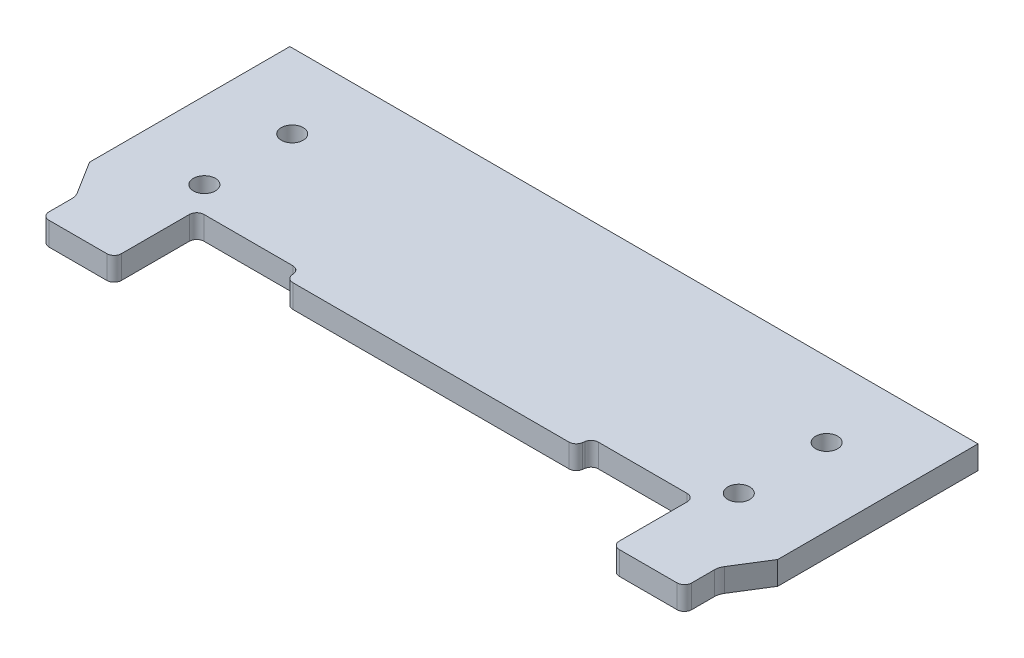
ISO-10303-21;
HEADER;
FILE_DESCRIPTION(('STEP AP214'),'2;1');
FILE_NAME('part.step','',(''),(''),'','','');
FILE_SCHEMA(('AUTOMOTIVE_DESIGN { 1 0 10303 214 1 1 1 1 }'));
ENDSEC;
DATA;
#1=APPLICATION_CONTEXT('core data for automotive mechanical design processes');
#2=APPLICATION_PROTOCOL_DEFINITION('international standard','automotive_design',2000,#1);
#3=PRODUCT_CONTEXT('',#1,'mechanical');
#4=PRODUCT('Part','Part','',(#3));
#5=PRODUCT_RELATED_PRODUCT_CATEGORY('part','',(#4));
#6=PRODUCT_DEFINITION_FORMATION('','',#4);
#7=PRODUCT_DEFINITION_CONTEXT('part definition',#1,'design');
#8=PRODUCT_DEFINITION('design','',#6,#7);
#9=PRODUCT_DEFINITION_SHAPE('','',#8);
#10=(LENGTH_UNIT() NAMED_UNIT(*) SI_UNIT(.MILLI.,.METRE.));
#11=(NAMED_UNIT(*) PLANE_ANGLE_UNIT() SI_UNIT($,.RADIAN.));
#12=(NAMED_UNIT(*) SI_UNIT($,.STERADIAN.) SOLID_ANGLE_UNIT());
#13=UNCERTAINTY_MEASURE_WITH_UNIT(LENGTH_MEASURE(1.E-05),#10,'distance_accuracy_value','');
#14=(GEOMETRIC_REPRESENTATION_CONTEXT(3) GLOBAL_UNCERTAINTY_ASSIGNED_CONTEXT((#13)) GLOBAL_UNIT_ASSIGNED_CONTEXT((#10,
#11,#12)) REPRESENTATION_CONTEXT('',''));
#15=CARTESIAN_POINT('',(0.,0.,0.));
#16=DIRECTION('',(0.,0.,1.));
#17=DIRECTION('',(1.,0.,0.));
#18=AXIS2_PLACEMENT_3D('',#15,#16,#17);
#19=CARTESIAN_POINT('',(0.,-1.5875,0.));
#20=DIRECTION('',(0.,1.,0.));
#21=DIRECTION('',(0.,0.,1.));
#22=AXIS2_PLACEMENT_3D('',#19,#20,#21);
#23=PLANE('',#22);
#24=CARTESIAN_POINT('',(36.5,-1.5875,38.));
#25=DIRECTION('',(0.,-1.,0.));
#26=DIRECTION('',(0.,0.,-1.));
#27=AXIS2_PLACEMENT_3D('',#24,#25,#26);
#28=CIRCLE('',#27,1.5);
#29=CARTESIAN_POINT('',(36.5,-1.5875,36.5));
#30=VERTEX_POINT('',#29);
#31=EDGE_CURVE('E281',#30,#30,#28,.T.);
#32=ORIENTED_EDGE('',*,*,#31,.F.);
#33=EDGE_LOOP('',(#32));
#34=FACE_BOUND('',#33,.T.);
#35=CARTESIAN_POINT('',(36.5,-1.5875,50.));
#36=DIRECTION('',(0.,-1.,0.));
#37=DIRECTION('',(0.,0.,-1.));
#38=AXIS2_PLACEMENT_3D('',#35,#36,#37);
#39=CIRCLE('',#38,1.5);
#40=CARTESIAN_POINT('',(36.5,-1.5875,48.5));
#41=VERTEX_POINT('',#40);
#42=EDGE_CURVE('E275',#41,#41,#39,.T.);
#43=ORIENTED_EDGE('',*,*,#42,.F.);
#44=EDGE_LOOP('',(#43));
#45=FACE_BOUND('',#44,.T.);
#46=CARTESIAN_POINT('',(-36.5,-1.5875,38.));
#47=DIRECTION('',(0.,-1.,0.));
#48=DIRECTION('',(0.,0.,-1.));
#49=AXIS2_PLACEMENT_3D('',#46,#47,#48);
#50=CIRCLE('',#49,1.5);
#51=CARTESIAN_POINT('',(-36.5,-1.5875,36.5));
#52=VERTEX_POINT('',#51);
#53=EDGE_CURVE('E269',#52,#52,#50,.T.);
#54=ORIENTED_EDGE('',*,*,#53,.F.);
#55=EDGE_LOOP('',(#54));
#56=FACE_BOUND('',#55,.T.);
#57=CARTESIAN_POINT('',(-36.5,-1.5875,50.));
#58=DIRECTION('',(0.,-1.,0.));
#59=DIRECTION('',(0.,0.,-1.));
#60=AXIS2_PLACEMENT_3D('',#57,#58,#59);
#61=CIRCLE('',#60,1.5);
#62=CARTESIAN_POINT('',(-36.5,-1.5875,48.5));
#63=VERTEX_POINT('',#62);
#64=EDGE_CURVE('E263',#63,#63,#61,.T.);
#65=ORIENTED_EDGE('',*,*,#64,.F.);
#66=EDGE_LOOP('',(#65));
#67=FACE_BOUND('',#66,.T.);
#68=DIRECTION('',(0.,0.,1.));
#69=VECTOR('',#68,1.);
#70=CARTESIAN_POINT('',(-47.,-1.5875,67.8266002747816));
#71=LINE('',#70,#69);
#72=CARTESIAN_POINT('',(-47.,-1.5875,27.8266002747816));
#73=VERTEX_POINT('',#72);
#74=CARTESIAN_POINT('',(-47.,-1.5875,55.1814992477408));
#75=VERTEX_POINT('',#74);
#76=EDGE_CURVE('E237',#73,#75,#71,.T.);
#77=ORIENTED_EDGE('',*,*,#76,.F.);
#78=DIRECTION('',(-1.,0.,0.));
#79=VECTOR('',#78,1.);
#80=CARTESIAN_POINT('',(-47.,-1.5875,27.8266002747816));
#81=LINE('',#80,#79);
#82=CARTESIAN_POINT('',(47.,-1.5875,27.8266002747816));
#83=VERTEX_POINT('',#82);
#84=EDGE_CURVE('E236',#83,#73,#81,.T.);
#85=ORIENTED_EDGE('',*,*,#84,.F.);
#86=DIRECTION('',(0.,0.,-1.));
#87=VECTOR('',#86,1.);
#88=CARTESIAN_POINT('',(47.,-1.5875,67.8266002747816));
#89=LINE('',#88,#87);
#90=CARTESIAN_POINT('',(47.,-1.5875,55.1814992477408));
#91=VERTEX_POINT('',#90);
#92=EDGE_CURVE('E227',#91,#83,#89,.T.);
#93=ORIENTED_EDGE('',*,*,#92,.F.);
#94=DIRECTION('',(0.529919264233203,0.,-0.848048096156427));
#95=VECTOR('',#94,1.);
#96=CARTESIAN_POINT('',(58.6001234444091,-1.5875,36.6174211585143));
#97=LINE('',#96,#95);
#98=CARTESIAN_POINT('',(44.198394579911,-1.5875,59.6650051382578));
#99=VERTEX_POINT('',#98);
#100=EDGE_CURVE('E256',#99,#91,#97,.T.);
#101=ORIENTED_EDGE('',*,*,#100,.F.);
#102=CARTESIAN_POINT('',(45.8944907722239,-1.5875,60.7248436667242));
#103=DIRECTION('',(0.,1.,0.));
#104=DIRECTION('',(0.,0.,1.));
#105=AXIS2_PLACEMENT_3D('',#102,#103,#104);
#106=CIRCLE('',#105,2.);
#107=CARTESIAN_POINT('',(43.8944907722239,-1.5875,60.7248436667242));
#108=VERTEX_POINT('',#107);
#109=EDGE_CURVE('E363',#99,#108,#106,.T.);
#110=ORIENTED_EDGE('',*,*,#109,.T.);
#111=DIRECTION('',(0.,0.,-1.));
#112=VECTOR('',#111,1.);
#113=CARTESIAN_POINT('',(43.8944907722239,-1.5875,0.));
#114=LINE('',#113,#112);
#115=CARTESIAN_POINT('',(43.8944907722239,-1.5875,63.8266002747816));
#116=VERTEX_POINT('',#115);
#117=EDGE_CURVE('E291',#116,#108,#114,.T.);
#118=ORIENTED_EDGE('',*,*,#117,.F.);
#119=CARTESIAN_POINT('',(42.8944907722239,-1.5875,63.8266002747816));
#120=DIRECTION('',(0.,1.,0.));
#121=DIRECTION('',(0.,0.,1.));
#122=AXIS2_PLACEMENT_3D('',#119,#120,#121);
#123=CIRCLE('',#122,1.);
#124=CARTESIAN_POINT('',(42.8944907722239,-1.5875,64.8266002747816));
#125=VERTEX_POINT('',#124);
#126=EDGE_CURVE('E384',#116,#125,#123,.F.);
#127=ORIENTED_EDGE('',*,*,#126,.T.);
#128=DIRECTION('',(-1.,0.,0.));
#129=VECTOR('',#128,1.);
#130=CARTESIAN_POINT('',(0.,-1.5875,64.8266002747816));
#131=LINE('',#130,#129);
#132=CARTESIAN_POINT('',(35.,-1.5875,64.8266002747816));
#133=VERTEX_POINT('',#132);
#134=EDGE_CURVE('E346',#125,#133,#131,.T.);
#135=ORIENTED_EDGE('',*,*,#134,.T.);
#136=CARTESIAN_POINT('',(35.,-1.5875,63.8266002747816));
#137=DIRECTION('',(0.,1.,0.));
#138=DIRECTION('',(0.,0.,1.));
#139=AXIS2_PLACEMENT_3D('',#136,#137,#138);
#140=CIRCLE('',#139,1.);
#141=CARTESIAN_POINT('',(34.,-1.5875,63.8266002747816));
#142=VERTEX_POINT('',#141);
#143=EDGE_CURVE('E378',#133,#142,#140,.F.);
#144=ORIENTED_EDGE('',*,*,#143,.T.);
#145=DIRECTION('',(0.,0.,-1.));
#146=VECTOR('',#145,1.);
#147=CARTESIAN_POINT('',(34.,-1.5875,0.));
#148=LINE('',#147,#146);
#149=CARTESIAN_POINT('',(34.,-1.5875,54.55));
#150=VERTEX_POINT('',#149);
#151=EDGE_CURVE('E343',#142,#150,#148,.T.);
#152=ORIENTED_EDGE('',*,*,#151,.T.);
#153=CARTESIAN_POINT('',(33.,-1.5875,54.55));
#154=DIRECTION('',(0.,1.,0.));
#155=DIRECTION('',(0.,0.,1.));
#156=AXIS2_PLACEMENT_3D('',#153,#154,#155);
#157=CIRCLE('',#156,1.);
#158=CARTESIAN_POINT('',(33.,-1.5875,53.55));
#159=VERTEX_POINT('',#158);
#160=EDGE_CURVE('E452',#150,#159,#157,.T.);
#161=ORIENTED_EDGE('',*,*,#160,.T.);
#162=DIRECTION('',(-1.,0.,0.));
#163=VECTOR('',#162,1.);
#164=CARTESIAN_POINT('',(0.,-1.5875,53.55));
#165=LINE('',#164,#163);
#166=CARTESIAN_POINT('',(20.8692867378162,-1.5875,53.55));
#167=VERTEX_POINT('',#166);
#168=EDGE_CURVE('E340',#159,#167,#165,.T.);
#169=ORIENTED_EDGE('',*,*,#168,.T.);
#170=CARTESIAN_POINT('',(20.8692867378162,-1.5875,54.55));
#171=DIRECTION('',(0.,1.,0.));
#172=DIRECTION('',(0.,0.,1.));
#173=AXIS2_PLACEMENT_3D('',#170,#171,#172);
#174=CIRCLE('',#173,1.);
#175=CARTESIAN_POINT('',(19.8790186690747,-1.5875,54.4108268990399));
#176=VERTEX_POINT('',#175);
#177=EDGE_CURVE('E448',#167,#176,#174,.T.);
#178=ORIENTED_EDGE('',*,*,#177,.T.);
#179=DIRECTION('',(-0.139173100960063,0.,0.990268068741571));
#180=VECTOR('',#179,1.);
#181=CARTESIAN_POINT('',(26.9928071613832,-1.5875,3.79359164942141));
#182=LINE('',#181,#180);
#183=CARTESIAN_POINT('',(19.8398996615206,-1.5875,54.6891731009601));
#184=VERTEX_POINT('',#183);
#185=EDGE_CURVE('E337',#176,#184,#182,.T.);
#186=ORIENTED_EDGE('',*,*,#185,.T.);
#187=CARTESIAN_POINT('',(18.849631592779,-1.5875,54.55));
#188=DIRECTION('',(0.,1.,0.));
#189=DIRECTION('',(0.,0.,1.));
#190=AXIS2_PLACEMENT_3D('',#187,#188,#189);
#191=CIRCLE('',#190,1.);
#192=CARTESIAN_POINT('',(18.849631592779,-1.5875,55.55));
#193=VERTEX_POINT('',#192);
#194=EDGE_CURVE('E382',#184,#193,#191,.F.);
#195=ORIENTED_EDGE('',*,*,#194,.T.);
#196=DIRECTION('',(1.,0.,0.));
#197=VECTOR('',#196,1.);
#198=CARTESIAN_POINT('',(0.,-1.5875,55.55));
#199=LINE('',#198,#197);
#200=CARTESIAN_POINT('',(-18.849631592779,-1.5875,55.55));
#201=VERTEX_POINT('',#200);
#202=EDGE_CURVE('E334',#201,#193,#199,.T.);
#203=ORIENTED_EDGE('',*,*,#202,.F.);
#204=CARTESIAN_POINT('',(-18.849631592779,-1.5875,54.55));
#205=DIRECTION('',(0.,1.,0.));
#206=DIRECTION('',(0.,0.,1.));
#207=AXIS2_PLACEMENT_3D('',#204,#205,#206);
#208=CIRCLE('',#207,1.);
#209=CARTESIAN_POINT('',(-19.8398996615206,-1.5875,54.6891731009601));
#210=VERTEX_POINT('',#209);
#211=EDGE_CURVE('E380',#201,#210,#208,.F.);
#212=ORIENTED_EDGE('',*,*,#211,.T.);
#213=DIRECTION('',(0.139173100960063,0.,0.990268068741571));
#214=VECTOR('',#213,1.);
#215=CARTESIAN_POINT('',(-26.9928071613832,-1.5875,3.7935916494214));
#216=LINE('',#215,#214);
#217=CARTESIAN_POINT('',(-19.8790186690747,-1.5875,54.4108268990399));
#218=VERTEX_POINT('',#217);
#219=EDGE_CURVE('E331',#218,#210,#216,.T.);
#220=ORIENTED_EDGE('',*,*,#219,.F.);
#221=CARTESIAN_POINT('',(-20.8692867378162,-1.5875,54.55));
#222=DIRECTION('',(0.,1.,0.));
#223=DIRECTION('',(0.,0.,1.));
#224=AXIS2_PLACEMENT_3D('',#221,#222,#223);
#225=CIRCLE('',#224,1.);
#226=CARTESIAN_POINT('',(-20.8692867378162,-1.5875,53.55));
#227=VERTEX_POINT('',#226);
#228=EDGE_CURVE('E444',#218,#227,#225,.T.);
#229=ORIENTED_EDGE('',*,*,#228,.T.);
#230=DIRECTION('',(1.,0.,0.));
#231=VECTOR('',#230,1.);
#232=CARTESIAN_POINT('',(0.,-1.5875,53.55));
#233=LINE('',#232,#231);
#234=CARTESIAN_POINT('',(-33.,-1.5875,53.55));
#235=VERTEX_POINT('',#234);
#236=EDGE_CURVE('E328',#235,#227,#233,.T.);
#237=ORIENTED_EDGE('',*,*,#236,.F.);
#238=CARTESIAN_POINT('',(-33.,-1.5875,54.55));
#239=DIRECTION('',(0.,1.,0.));
#240=DIRECTION('',(0.,0.,1.));
#241=AXIS2_PLACEMENT_3D('',#238,#239,#240);
#242=CIRCLE('',#241,1.);
#243=CARTESIAN_POINT('',(-34.,-1.5875,54.55));
#244=VERTEX_POINT('',#243);
#245=EDGE_CURVE('E456',#235,#244,#242,.T.);
#246=ORIENTED_EDGE('',*,*,#245,.T.);
#247=DIRECTION('',(0.,0.,1.));
#248=VECTOR('',#247,1.);
#249=CARTESIAN_POINT('',(-34.0000000000001,-1.5875,0.));
#250=LINE('',#249,#248);
#251=CARTESIAN_POINT('',(-34.,-1.5875,63.8266002747816));
#252=VERTEX_POINT('',#251);
#253=EDGE_CURVE('E325',#244,#252,#250,.T.);
#254=ORIENTED_EDGE('',*,*,#253,.T.);
#255=CARTESIAN_POINT('',(-35.,-1.5875,63.8266002747816));
#256=DIRECTION('',(0.,1.,0.));
#257=DIRECTION('',(0.,0.,1.));
#258=AXIS2_PLACEMENT_3D('',#255,#256,#257);
#259=CIRCLE('',#258,1.);
#260=CARTESIAN_POINT('',(-35.,-1.5875,64.8266002747816));
#261=VERTEX_POINT('',#260);
#262=EDGE_CURVE('E376',#252,#261,#259,.F.);
#263=ORIENTED_EDGE('',*,*,#262,.T.);
#264=DIRECTION('',(-1.,0.,0.));
#265=VECTOR('',#264,1.);
#266=CARTESIAN_POINT('',(0.,-1.5875,64.8266002747816));
#267=LINE('',#266,#265);
#268=CARTESIAN_POINT('',(-42.8944907722239,-1.5875,64.8266002747816));
#269=VERTEX_POINT('',#268);
#270=EDGE_CURVE('E322',#261,#269,#267,.T.);
#271=ORIENTED_EDGE('',*,*,#270,.T.);
#272=CARTESIAN_POINT('',(-42.8944907722239,-1.5875,63.8266002747816));
#273=DIRECTION('',(0.,1.,0.));
#274=DIRECTION('',(0.,0.,1.));
#275=AXIS2_PLACEMENT_3D('',#272,#273,#274);
#276=CIRCLE('',#275,1.);
#277=CARTESIAN_POINT('',(-43.8944907722239,-1.5875,63.8266002747816));
#278=VERTEX_POINT('',#277);
#279=EDGE_CURVE('E386',#269,#278,#276,.F.);
#280=ORIENTED_EDGE('',*,*,#279,.T.);
#281=DIRECTION('',(0.,0.,-1.));
#282=VECTOR('',#281,1.);
#283=CARTESIAN_POINT('',(-43.8944907722239,-1.5875,0.));
#284=LINE('',#283,#282);
#285=CARTESIAN_POINT('',(-43.8944907722239,-1.5875,60.7248436667241));
#286=VERTEX_POINT('',#285);
#287=EDGE_CURVE('E287',#278,#286,#284,.T.);
#288=ORIENTED_EDGE('',*,*,#287,.T.);
#289=CARTESIAN_POINT('',(-45.8944907722239,-1.5875,60.7248436667241));
#290=DIRECTION('',(0.,1.,0.));
#291=DIRECTION('',(0.,0.,1.));
#292=AXIS2_PLACEMENT_3D('',#289,#290,#291);
#293=CIRCLE('',#292,2.);
#294=CARTESIAN_POINT('',(-44.198394579911,-1.5875,59.6650051382577));
#295=VERTEX_POINT('',#294);
#296=EDGE_CURVE('E369',#286,#295,#293,.T.);
#297=ORIENTED_EDGE('',*,*,#296,.T.);
#298=DIRECTION('',(-0.529919264233203,0.,-0.848048096156427));
#299=VECTOR('',#298,1.);
#300=CARTESIAN_POINT('',(-58.600123444409,-1.5875,36.6174211585143));
#301=LINE('',#300,#299);
#302=EDGE_CURVE('E261',#295,#75,#301,.T.);
#303=ORIENTED_EDGE('',*,*,#302,.T.);
#304=EDGE_LOOP('',(#77,#85,#93,#101,#110,#118,#127,#135,#144,#152,#161,#169,#178,#186,#195,#203,
#212,#220,#229,#237,#246,#254,#263,#271,#280,#288,#297,#303));
#305=FACE_BOUND('',#304,.T.);
#306=ADVANCED_FACE('F42',(#34,#45,#56,#67,#305),#23,.F.);
#307=CARTESIAN_POINT('',(0.,1.5875,0.));
#308=DIRECTION('',(0.,1.,0.));
#309=DIRECTION('',(0.,0.,1.));
#310=AXIS2_PLACEMENT_3D('',#307,#308,#309);
#311=PLANE('',#310);
#312=CARTESIAN_POINT('',(36.5,1.5875,38.));
#313=DIRECTION('',(0.,-1.,0.));
#314=DIRECTION('',(0.,0.,-1.));
#315=AXIS2_PLACEMENT_3D('',#312,#313,#314);
#316=CIRCLE('',#315,1.5);
#317=CARTESIAN_POINT('',(36.5,1.5875,36.5));
#318=VERTEX_POINT('',#317);
#319=EDGE_CURVE('E284',#318,#318,#316,.T.);
#320=ORIENTED_EDGE('',*,*,#319,.T.);
#321=EDGE_LOOP('',(#320));
#322=FACE_BOUND('',#321,.T.);
#323=CARTESIAN_POINT('',(36.5,1.5875,50.));
#324=DIRECTION('',(0.,-1.,0.));
#325=DIRECTION('',(0.,0.,-1.));
#326=AXIS2_PLACEMENT_3D('',#323,#324,#325);
#327=CIRCLE('',#326,1.5);
#328=CARTESIAN_POINT('',(36.5,1.5875,48.5));
#329=VERTEX_POINT('',#328);
#330=EDGE_CURVE('E278',#329,#329,#327,.T.);
#331=ORIENTED_EDGE('',*,*,#330,.T.);
#332=EDGE_LOOP('',(#331));
#333=FACE_BOUND('',#332,.T.);
#334=CARTESIAN_POINT('',(-36.5,1.5875,38.));
#335=DIRECTION('',(0.,-1.,0.));
#336=DIRECTION('',(0.,0.,-1.));
#337=AXIS2_PLACEMENT_3D('',#334,#335,#336);
#338=CIRCLE('',#337,1.5);
#339=CARTESIAN_POINT('',(-36.5,1.5875,36.5));
#340=VERTEX_POINT('',#339);
#341=EDGE_CURVE('E272',#340,#340,#338,.T.);
#342=ORIENTED_EDGE('',*,*,#341,.T.);
#343=EDGE_LOOP('',(#342));
#344=FACE_BOUND('',#343,.T.);
#345=CARTESIAN_POINT('',(-36.5,1.5875,50.));
#346=DIRECTION('',(0.,-1.,0.));
#347=DIRECTION('',(0.,0.,-1.));
#348=AXIS2_PLACEMENT_3D('',#345,#346,#347);
#349=CIRCLE('',#348,1.5);
#350=CARTESIAN_POINT('',(-36.5,1.5875,48.5));
#351=VERTEX_POINT('',#350);
#352=EDGE_CURVE('E266',#351,#351,#349,.T.);
#353=ORIENTED_EDGE('',*,*,#352,.T.);
#354=EDGE_LOOP('',(#353));
#355=FACE_BOUND('',#354,.T.);
#356=DIRECTION('',(-1.,0.,0.));
#357=VECTOR('',#356,1.);
#358=CARTESIAN_POINT('',(0.,1.5875,27.8266002747816));
#359=LINE('',#358,#357);
#360=CARTESIAN_POINT('',(47.,1.5875,27.8266002747816));
#361=VERTEX_POINT('',#360);
#362=CARTESIAN_POINT('',(-47.,1.5875,27.8266002747816));
#363=VERTEX_POINT('',#362);
#364=EDGE_CURVE('E12',#361,#363,#359,.T.);
#365=ORIENTED_EDGE('',*,*,#364,.T.);
#366=DIRECTION('',(0.,0.,1.));
#367=VECTOR('',#366,1.);
#368=CARTESIAN_POINT('',(-47.,1.5875,0.));
#369=LINE('',#368,#367);
#370=CARTESIAN_POINT('',(-47.,1.5875,55.1814992477408));
#371=VERTEX_POINT('',#370);
#372=EDGE_CURVE('E252',#363,#371,#369,.T.);
#373=ORIENTED_EDGE('',*,*,#372,.T.);
#374=DIRECTION('',(0.529919264233203,0.,0.848048096156427));
#375=VECTOR('',#374,1.);
#376=CARTESIAN_POINT('',(-58.600123444409,1.5875,36.6174211585143));
#377=LINE('',#376,#375);
#378=CARTESIAN_POINT('',(-44.198394579911,1.5875,59.6650051382577));
#379=VERTEX_POINT('',#378);
#380=EDGE_CURVE('E258',#371,#379,#377,.T.);
#381=ORIENTED_EDGE('',*,*,#380,.T.);
#382=CARTESIAN_POINT('',(-45.8944907722239,1.5875,60.7248436667241));
#383=DIRECTION('',(0.,1.,0.));
#384=DIRECTION('',(0.,0.,1.));
#385=AXIS2_PLACEMENT_3D('',#382,#383,#384);
#386=CIRCLE('',#385,2.);
#387=CARTESIAN_POINT('',(-43.8944907722239,1.5875,60.7248436667241));
#388=VERTEX_POINT('',#387);
#389=EDGE_CURVE('E366',#379,#388,#386,.F.);
#390=ORIENTED_EDGE('',*,*,#389,.T.);
#391=DIRECTION('',(0.,0.,-1.));
#392=VECTOR('',#391,1.);
#393=CARTESIAN_POINT('',(-43.8944907722239,1.5875,0.));
#394=LINE('',#393,#392);
#395=CARTESIAN_POINT('',(-43.8944907722239,1.5875,63.8266002747816));
#396=VERTEX_POINT('',#395);
#397=EDGE_CURVE('E288',#396,#388,#394,.T.);
#398=ORIENTED_EDGE('',*,*,#397,.F.);
#399=CARTESIAN_POINT('',(-42.8944907722239,1.5875,63.8266002747816));
#400=DIRECTION('',(0.,1.,0.));
#401=DIRECTION('',(0.,0.,1.));
#402=AXIS2_PLACEMENT_3D('',#399,#400,#401);
#403=CIRCLE('',#402,1.);
#404=CARTESIAN_POINT('',(-42.8944907722239,1.5875,64.8266002747816));
#405=VERTEX_POINT('',#404);
#406=EDGE_CURVE('E399',#396,#405,#403,.T.);
#407=ORIENTED_EDGE('',*,*,#406,.T.);
#408=DIRECTION('',(-1.,0.,0.));
#409=VECTOR('',#408,1.);
#410=CARTESIAN_POINT('',(0.,1.5875,64.8266002747816));
#411=LINE('',#410,#409);
#412=CARTESIAN_POINT('',(-35.,1.5875,64.8266002747816));
#413=VERTEX_POINT('',#412);
#414=EDGE_CURVE('E290',#413,#405,#411,.T.);
#415=ORIENTED_EDGE('',*,*,#414,.F.);
#416=CARTESIAN_POINT('',(-35.,1.5875,63.8266002747816));
#417=DIRECTION('',(0.,1.,0.));
#418=DIRECTION('',(0.,0.,1.));
#419=AXIS2_PLACEMENT_3D('',#416,#417,#418);
#420=CIRCLE('',#419,1.);
#421=CARTESIAN_POINT('',(-34.,1.5875,63.8266002747816));
#422=VERTEX_POINT('',#421);
#423=EDGE_CURVE('E390',#413,#422,#420,.T.);
#424=ORIENTED_EDGE('',*,*,#423,.T.);
#425=DIRECTION('',(0.,0.,1.));
#426=VECTOR('',#425,1.);
#427=CARTESIAN_POINT('',(-34.0000000000001,1.5875,0.));
#428=LINE('',#427,#426);
#429=CARTESIAN_POINT('',(-34.,1.5875,54.55));
#430=VERTEX_POINT('',#429);
#431=EDGE_CURVE('E294',#430,#422,#428,.T.);
#432=ORIENTED_EDGE('',*,*,#431,.F.);
#433=CARTESIAN_POINT('',(-33.,1.5875,54.55));
#434=DIRECTION('',(0.,1.,0.));
#435=DIRECTION('',(0.,0.,1.));
#436=AXIS2_PLACEMENT_3D('',#433,#434,#435);
#437=CIRCLE('',#436,1.);
#438=CARTESIAN_POINT('',(-33.,1.5875,53.55));
#439=VERTEX_POINT('',#438);
#440=EDGE_CURVE('E458',#430,#439,#437,.F.);
#441=ORIENTED_EDGE('',*,*,#440,.T.);
#442=DIRECTION('',(1.,0.,0.));
#443=VECTOR('',#442,1.);
#444=CARTESIAN_POINT('',(0.,1.5875,53.55));
#445=LINE('',#444,#443);
#446=CARTESIAN_POINT('',(-20.8692867378162,1.5875,53.55));
#447=VERTEX_POINT('',#446);
#448=EDGE_CURVE('E297',#439,#447,#445,.T.);
#449=ORIENTED_EDGE('',*,*,#448,.T.);
#450=CARTESIAN_POINT('',(-20.8692867378162,1.5875,54.55));
#451=DIRECTION('',(0.,1.,0.));
#452=DIRECTION('',(0.,0.,1.));
#453=AXIS2_PLACEMENT_3D('',#450,#451,#452);
#454=CIRCLE('',#453,1.);
#455=CARTESIAN_POINT('',(-19.8790186690747,1.5875,54.4108268990399));
#456=VERTEX_POINT('',#455);
#457=EDGE_CURVE('E446',#447,#456,#454,.F.);
#458=ORIENTED_EDGE('',*,*,#457,.T.);
#459=DIRECTION('',(0.139173100960063,0.,0.990268068741571));
#460=VECTOR('',#459,1.);
#461=CARTESIAN_POINT('',(-26.9928071613832,1.5875,3.7935916494214));
#462=LINE('',#461,#460);
#463=CARTESIAN_POINT('',(-19.8398996615206,1.5875,54.6891731009601));
#464=VERTEX_POINT('',#463);
#465=EDGE_CURVE('E300',#456,#464,#462,.T.);
#466=ORIENTED_EDGE('',*,*,#465,.T.);
#467=CARTESIAN_POINT('',(-18.849631592779,1.5875,54.55));
#468=DIRECTION('',(0.,1.,0.));
#469=DIRECTION('',(0.,0.,1.));
#470=AXIS2_PLACEMENT_3D('',#467,#468,#469);
#471=CIRCLE('',#470,1.);
#472=CARTESIAN_POINT('',(-18.849631592779,1.5875,55.55));
#473=VERTEX_POINT('',#472);
#474=EDGE_CURVE('E394',#464,#473,#471,.T.);
#475=ORIENTED_EDGE('',*,*,#474,.T.);
#476=DIRECTION('',(1.,0.,0.));
#477=VECTOR('',#476,1.);
#478=CARTESIAN_POINT('',(0.,1.5875,55.55));
#479=LINE('',#478,#477);
#480=CARTESIAN_POINT('',(18.849631592779,1.5875,55.55));
#481=VERTEX_POINT('',#480);
#482=EDGE_CURVE('E303',#473,#481,#479,.T.);
#483=ORIENTED_EDGE('',*,*,#482,.T.);
#484=CARTESIAN_POINT('',(18.849631592779,1.5875,54.55));
#485=DIRECTION('',(0.,1.,0.));
#486=DIRECTION('',(0.,0.,1.));
#487=AXIS2_PLACEMENT_3D('',#484,#485,#486);
#488=CIRCLE('',#487,1.);
#489=CARTESIAN_POINT('',(19.8398996615206,1.5875,54.6891731009601));
#490=VERTEX_POINT('',#489);
#491=EDGE_CURVE('E396',#481,#490,#488,.T.);
#492=ORIENTED_EDGE('',*,*,#491,.T.);
#493=DIRECTION('',(-0.139173100960063,0.,0.990268068741571));
#494=VECTOR('',#493,1.);
#495=CARTESIAN_POINT('',(26.9928071613832,1.5875,3.79359164942141));
#496=LINE('',#495,#494);
#497=CARTESIAN_POINT('',(19.8790186690747,1.5875,54.4108268990399));
#498=VERTEX_POINT('',#497);
#499=EDGE_CURVE('E306',#498,#490,#496,.T.);
#500=ORIENTED_EDGE('',*,*,#499,.F.);
#501=CARTESIAN_POINT('',(20.8692867378162,1.5875,54.55));
#502=DIRECTION('',(0.,1.,0.));
#503=DIRECTION('',(0.,0.,1.));
#504=AXIS2_PLACEMENT_3D('',#501,#502,#503);
#505=CIRCLE('',#504,1.);
#506=CARTESIAN_POINT('',(20.8692867378162,1.5875,53.55));
#507=VERTEX_POINT('',#506);
#508=EDGE_CURVE('E450',#498,#507,#505,.F.);
#509=ORIENTED_EDGE('',*,*,#508,.T.);
#510=DIRECTION('',(-1.,0.,0.));
#511=VECTOR('',#510,1.);
#512=CARTESIAN_POINT('',(0.,1.5875,53.55));
#513=LINE('',#512,#511);
#514=CARTESIAN_POINT('',(33.,1.5875,53.55));
#515=VERTEX_POINT('',#514);
#516=EDGE_CURVE('E309',#515,#507,#513,.T.);
#517=ORIENTED_EDGE('',*,*,#516,.F.);
#518=CARTESIAN_POINT('',(33.,1.5875,54.55));
#519=DIRECTION('',(0.,1.,0.));
#520=DIRECTION('',(0.,0.,1.));
#521=AXIS2_PLACEMENT_3D('',#518,#519,#520);
#522=CIRCLE('',#521,1.);
#523=CARTESIAN_POINT('',(34.,1.5875,54.55));
#524=VERTEX_POINT('',#523);
#525=EDGE_CURVE('E454',#515,#524,#522,.F.);
#526=ORIENTED_EDGE('',*,*,#525,.T.);
#527=DIRECTION('',(0.,0.,-1.));
#528=VECTOR('',#527,1.);
#529=CARTESIAN_POINT('',(34.,1.5875,0.));
#530=LINE('',#529,#528);
#531=CARTESIAN_POINT('',(34.,1.5875,63.8266002747816));
#532=VERTEX_POINT('',#531);
#533=EDGE_CURVE('E312',#532,#524,#530,.T.);
#534=ORIENTED_EDGE('',*,*,#533,.F.);
#535=CARTESIAN_POINT('',(35.,1.5875,63.8266002747816));
#536=DIRECTION('',(0.,1.,0.));
#537=DIRECTION('',(0.,0.,1.));
#538=AXIS2_PLACEMENT_3D('',#535,#536,#537);
#539=CIRCLE('',#538,1.);
#540=CARTESIAN_POINT('',(35.,1.5875,64.8266002747816));
#541=VERTEX_POINT('',#540);
#542=EDGE_CURVE('E392',#532,#541,#539,.T.);
#543=ORIENTED_EDGE('',*,*,#542,.T.);
#544=DIRECTION('',(-1.,0.,0.));
#545=VECTOR('',#544,1.);
#546=CARTESIAN_POINT('',(0.,1.5875,64.8266002747816));
#547=LINE('',#546,#545);
#548=CARTESIAN_POINT('',(42.8944907722239,1.5875,64.8266002747816));
#549=VERTEX_POINT('',#548);
#550=EDGE_CURVE('E315',#549,#541,#547,.T.);
#551=ORIENTED_EDGE('',*,*,#550,.F.);
#552=CARTESIAN_POINT('',(42.8944907722239,1.5875,63.8266002747816));
#553=DIRECTION('',(0.,1.,0.));
#554=DIRECTION('',(0.,0.,1.));
#555=AXIS2_PLACEMENT_3D('',#552,#553,#554);
#556=CIRCLE('',#555,1.);
#557=CARTESIAN_POINT('',(43.8944907722239,1.5875,63.8266002747816));
#558=VERTEX_POINT('',#557);
#559=EDGE_CURVE('E65',#549,#558,#556,.T.);
#560=ORIENTED_EDGE('',*,*,#559,.T.);
#561=DIRECTION('',(0.,0.,-1.));
#562=VECTOR('',#561,1.);
#563=CARTESIAN_POINT('',(43.8944907722239,1.5875,0.));
#564=LINE('',#563,#562);
#565=CARTESIAN_POINT('',(43.8944907722239,1.5875,60.7248436667242));
#566=VERTEX_POINT('',#565);
#567=EDGE_CURVE('E318',#558,#566,#564,.T.);
#568=ORIENTED_EDGE('',*,*,#567,.T.);
#569=CARTESIAN_POINT('',(45.8944907722239,1.5875,60.7248436667242));
#570=DIRECTION('',(0.,1.,0.));
#571=DIRECTION('',(0.,0.,1.));
#572=AXIS2_PLACEMENT_3D('',#569,#570,#571);
#573=CIRCLE('',#572,2.);
#574=CARTESIAN_POINT('',(44.198394579911,1.5875,59.6650051382578));
#575=VERTEX_POINT('',#574);
#576=EDGE_CURVE('E360',#566,#575,#573,.F.);
#577=ORIENTED_EDGE('',*,*,#576,.T.);
#578=DIRECTION('',(-0.529919264233203,0.,0.848048096156427));
#579=VECTOR('',#578,1.);
#580=CARTESIAN_POINT('',(58.6001234444091,1.5875,36.6174211585143));
#581=LINE('',#580,#579);
#582=CARTESIAN_POINT('',(47.,1.5875,55.1814992477408));
#583=VERTEX_POINT('',#582);
#584=EDGE_CURVE('E255',#583,#575,#581,.T.);
#585=ORIENTED_EDGE('',*,*,#584,.F.);
#586=DIRECTION('',(0.,0.,-1.));
#587=VECTOR('',#586,1.);
#588=CARTESIAN_POINT('',(47.,1.5875,0.));
#589=LINE('',#588,#587);
#590=EDGE_CURVE('E57',#583,#361,#589,.T.);
#591=ORIENTED_EDGE('',*,*,#590,.T.);
#592=EDGE_LOOP('',(#365,#373,#381,#390,#398,#407,#415,#424,#432,#441,#449,#458,#466,#475,#483,
#492,#500,#509,#517,#526,#534,#543,#551,#560,#568,#577,#585,#591));
#593=FACE_BOUND('',#592,.T.);
#594=ADVANCED_FACE('F474',(#322,#333,#344,#355,#593),#311,.T.);
#595=CARTESIAN_POINT('',(-58.600123444409,-54.0387091134937,36.6174211585143));
#596=DIRECTION('',(-0.848048096156427,0.,0.529919264233203));
#597=DIRECTION('',(0.529919264233203,0.,0.848048096156427));
#598=AXIS2_PLACEMENT_3D('',#595,#596,#597);
#599=PLANE('',#598);
#600=ORIENTED_EDGE('',*,*,#380,.F.);
#601=DIRECTION('',(0.,-1.,0.));
#602=VECTOR('',#601,1.);
#603=CARTESIAN_POINT('',(-47.,-54.0387091134937,55.1814992477408));
#604=LINE('',#603,#602);
#605=EDGE_CURVE('E50',#371,#75,#604,.T.);
#606=ORIENTED_EDGE('',*,*,#605,.T.);
#607=ORIENTED_EDGE('',*,*,#302,.F.);
#608=DIRECTION('',(0.,1.,0.));
#609=VECTOR('',#608,1.);
#610=CARTESIAN_POINT('',(-44.198394579911,1.5875,59.6650051382577));
#611=LINE('',#610,#609);
#612=EDGE_CURVE('E354',#295,#379,#611,.T.);
#613=ORIENTED_EDGE('',*,*,#612,.T.);
#614=EDGE_LOOP('',(#600,#606,#607,#613));
#615=FACE_BOUND('',#614,.T.);
#616=ADVANCED_FACE('F464',(#615),#599,.T.);
#617=CARTESIAN_POINT('',(58.6001234444091,-54.0387091134937,36.6174211585143));
#618=DIRECTION('',(-0.848048096156427,0.,-0.529919264233203));
#619=DIRECTION('',(-0.529919264233203,0.,0.848048096156427));
#620=AXIS2_PLACEMENT_3D('',#617,#618,#619);
#621=PLANE('',#620);
#622=DIRECTION('',(0.,-1.,0.));
#623=VECTOR('',#622,1.);
#624=CARTESIAN_POINT('',(47.,-54.0387091134937,55.1814992477408));
#625=LINE('',#624,#623);
#626=EDGE_CURVE('E231',#583,#91,#625,.T.);
#627=ORIENTED_EDGE('',*,*,#626,.F.);
#628=ORIENTED_EDGE('',*,*,#584,.T.);
#629=DIRECTION('',(0.,1.,0.));
#630=VECTOR('',#629,1.);
#631=CARTESIAN_POINT('',(44.198394579911,-1.5875,59.6650051382578));
#632=LINE('',#631,#630);
#633=EDGE_CURVE('E352',#575,#99,#632,.F.);
#634=ORIENTED_EDGE('',*,*,#633,.T.);
#635=ORIENTED_EDGE('',*,*,#100,.T.);
#636=EDGE_LOOP('',(#627,#628,#634,#635));
#637=FACE_BOUND('',#636,.T.);
#638=ADVANCED_FACE('F504',(#637),#621,.F.);
#639=CARTESIAN_POINT('',(43.8944907722239,1.5875,0.));
#640=DIRECTION('',(-1.,0.,0.));
#641=DIRECTION('',(0.,0.,1.));
#642=AXIS2_PLACEMENT_3D('',#639,#640,#641);
#643=PLANE('',#642);
#644=ORIENTED_EDGE('',*,*,#567,.F.);
#645=DIRECTION('',(0.,-1.,0.));
#646=VECTOR('',#645,1.);
#647=CARTESIAN_POINT('',(43.8944907722239,-1.5875,63.8266002747816));
#648=LINE('',#647,#646);
#649=EDGE_CURVE('E401',#558,#116,#648,.T.);
#650=ORIENTED_EDGE('',*,*,#649,.T.);
#651=ORIENTED_EDGE('',*,*,#117,.T.);
#652=DIRECTION('',(0.,1.,0.));
#653=VECTOR('',#652,1.);
#654=CARTESIAN_POINT('',(43.8944907722239,1.5875,60.7248436667242));
#655=LINE('',#654,#653);
#656=EDGE_CURVE('E320',#108,#566,#655,.T.);
#657=ORIENTED_EDGE('',*,*,#656,.T.);
#658=EDGE_LOOP('',(#644,#650,#651,#657));
#659=FACE_BOUND('',#658,.T.);
#660=ADVANCED_FACE('F500',(#659),#643,.F.);
#661=CARTESIAN_POINT('',(-43.8944907722239,1.5875,0.));
#662=DIRECTION('',(-1.,0.,0.));
#663=DIRECTION('',(0.,0.,1.));
#664=AXIS2_PLACEMENT_3D('',#661,#662,#663);
#665=PLANE('',#664);
#666=ORIENTED_EDGE('',*,*,#287,.F.);
#667=DIRECTION('',(0.,-1.,0.));
#668=VECTOR('',#667,1.);
#669=CARTESIAN_POINT('',(-43.8944907722239,1.5875,63.8266002747816));
#670=LINE('',#669,#668);
#671=EDGE_CURVE('E388',#278,#396,#670,.F.);
#672=ORIENTED_EDGE('',*,*,#671,.T.);
#673=ORIENTED_EDGE('',*,*,#397,.T.);
#674=DIRECTION('',(0.,1.,0.));
#675=VECTOR('',#674,1.);
#676=CARTESIAN_POINT('',(-43.8944907722239,-1.5875,60.7248436667241));
#677=LINE('',#676,#675);
#678=EDGE_CURVE('E357',#388,#286,#677,.F.);
#679=ORIENTED_EDGE('',*,*,#678,.T.);
#680=EDGE_LOOP('',(#666,#672,#673,#679));
#681=FACE_BOUND('',#680,.T.);
#682=ADVANCED_FACE('F503',(#681),#665,.T.);
#683=CARTESIAN_POINT('',(0.,1.5875,64.8266002747816));
#684=DIRECTION('',(0.,0.,1.));
#685=DIRECTION('',(1.,0.,0.));
#686=AXIS2_PLACEMENT_3D('',#683,#684,#685);
#687=PLANE('',#686);
#688=ORIENTED_EDGE('',*,*,#414,.T.);
#689=DIRECTION('',(0.,-1.,0.));
#690=VECTOR('',#689,1.);
#691=CARTESIAN_POINT('',(-42.8944907722239,1.5875,64.8266002747816));
#692=LINE('',#691,#690);
#693=EDGE_CURVE('E373',#405,#269,#692,.T.);
#694=ORIENTED_EDGE('',*,*,#693,.T.);
#695=ORIENTED_EDGE('',*,*,#270,.F.);
#696=DIRECTION('',(0.,-1.,0.));
#697=VECTOR('',#696,1.);
#698=CARTESIAN_POINT('',(-35.,1.5875,64.8266002747816));
#699=LINE('',#698,#697);
#700=EDGE_CURVE('E371',#261,#413,#699,.F.);
#701=ORIENTED_EDGE('',*,*,#700,.T.);
#702=EDGE_LOOP('',(#688,#694,#695,#701));
#703=FACE_BOUND('',#702,.T.);
#704=ADVANCED_FACE('F538',(#703),#687,.T.);
#705=CARTESIAN_POINT('',(-34.0000000000001,1.5875,0.));
#706=DIRECTION('',(1.,0.,0.));
#707=DIRECTION('',(0.,0.,-1.));
#708=AXIS2_PLACEMENT_3D('',#705,#706,#707);
#709=PLANE('',#708);
#710=ORIENTED_EDGE('',*,*,#253,.F.);
#711=DIRECTION('',(0.,-1.,0.));
#712=VECTOR('',#711,1.);
#713=CARTESIAN_POINT('',(-34.,1.5875,54.55));
#714=LINE('',#713,#712);
#715=EDGE_CURVE('E442',#244,#430,#714,.F.);
#716=ORIENTED_EDGE('',*,*,#715,.T.);
#717=ORIENTED_EDGE('',*,*,#431,.T.);
#718=DIRECTION('',(0.,-1.,0.));
#719=VECTOR('',#718,1.);
#720=CARTESIAN_POINT('',(-34.,1.5875,63.8266002747816));
#721=LINE('',#720,#719);
#722=EDGE_CURVE('E439',#422,#252,#721,.T.);
#723=ORIENTED_EDGE('',*,*,#722,.T.);
#724=EDGE_LOOP('',(#710,#716,#717,#723));
#725=FACE_BOUND('',#724,.T.);
#726=ADVANCED_FACE('F534',(#725),#709,.T.);
#727=CARTESIAN_POINT('',(0.,1.5875,53.55));
#728=DIRECTION('',(0.,0.,-1.));
#729=DIRECTION('',(-1.,0.,0.));
#730=AXIS2_PLACEMENT_3D('',#727,#728,#729);
#731=PLANE('',#730);
#732=ORIENTED_EDGE('',*,*,#236,.T.);
#733=DIRECTION('',(0.,-1.,0.));
#734=VECTOR('',#733,1.);
#735=CARTESIAN_POINT('',(-20.8692867378162,1.5875,53.55));
#736=LINE('',#735,#734);
#737=EDGE_CURVE('E427',#227,#447,#736,.F.);
#738=ORIENTED_EDGE('',*,*,#737,.T.);
#739=ORIENTED_EDGE('',*,*,#448,.F.);
#740=DIRECTION('',(0.,-1.,0.));
#741=VECTOR('',#740,1.);
#742=CARTESIAN_POINT('',(-33.,1.5875,53.55));
#743=LINE('',#742,#741);
#744=EDGE_CURVE('E424',#439,#235,#743,.T.);
#745=ORIENTED_EDGE('',*,*,#744,.T.);
#746=EDGE_LOOP('',(#732,#738,#739,#745));
#747=FACE_BOUND('',#746,.T.);
#748=ADVANCED_FACE('F530',(#747),#731,.F.);
#749=CARTESIAN_POINT('',(-26.9928071613832,1.5875,3.7935916494214));
#750=DIRECTION('',(0.990268068741571,0.,-0.139173100960063));
#751=DIRECTION('',(-0.139173100960063,0.,-0.990268068741571));
#752=AXIS2_PLACEMENT_3D('',#749,#750,#751);
#753=PLANE('',#752);
#754=ORIENTED_EDGE('',*,*,#219,.T.);
#755=DIRECTION('',(0.,-1.,0.));
#756=VECTOR('',#755,1.);
#757=CARTESIAN_POINT('',(-19.8398996615206,1.5875,54.6891731009601));
#758=LINE('',#757,#756);
#759=EDGE_CURVE('E422',#210,#464,#758,.F.);
#760=ORIENTED_EDGE('',*,*,#759,.T.);
#761=ORIENTED_EDGE('',*,*,#465,.F.);
#762=DIRECTION('',(0.,-1.,0.));
#763=VECTOR('',#762,1.);
#764=CARTESIAN_POINT('',(-19.8790186690747,-1.5875,54.4108268990399));
#765=LINE('',#764,#763);
#766=EDGE_CURVE('E419',#456,#218,#765,.T.);
#767=ORIENTED_EDGE('',*,*,#766,.T.);
#768=EDGE_LOOP('',(#754,#760,#761,#767));
#769=FACE_BOUND('',#768,.T.);
#770=ADVANCED_FACE('F526',(#769),#753,.F.);
#771=CARTESIAN_POINT('',(0.,1.5875,55.55));
#772=DIRECTION('',(0.,0.,-1.));
#773=DIRECTION('',(-1.,0.,0.));
#774=AXIS2_PLACEMENT_3D('',#771,#772,#773);
#775=PLANE('',#774);
#776=ORIENTED_EDGE('',*,*,#202,.T.);
#777=DIRECTION('',(0.,-1.,0.));
#778=VECTOR('',#777,1.);
#779=CARTESIAN_POINT('',(18.849631592779,1.5875,55.55));
#780=LINE('',#779,#778);
#781=EDGE_CURVE('E417',#193,#481,#780,.F.);
#782=ORIENTED_EDGE('',*,*,#781,.T.);
#783=ORIENTED_EDGE('',*,*,#482,.F.);
#784=DIRECTION('',(0.,-1.,0.));
#785=VECTOR('',#784,1.);
#786=CARTESIAN_POINT('',(-18.849631592779,1.5875,55.55));
#787=LINE('',#786,#785);
#788=EDGE_CURVE('E414',#473,#201,#787,.T.);
#789=ORIENTED_EDGE('',*,*,#788,.T.);
#790=EDGE_LOOP('',(#776,#782,#783,#789));
#791=FACE_BOUND('',#790,.T.);
#792=ADVANCED_FACE('F522',(#791),#775,.F.);
#793=CARTESIAN_POINT('',(26.9928071613832,1.5875,3.79359164942141));
#794=DIRECTION('',(0.990268068741571,0.,0.139173100960063));
#795=DIRECTION('',(0.139173100960063,0.,-0.990268068741571));
#796=AXIS2_PLACEMENT_3D('',#793,#794,#795);
#797=PLANE('',#796);
#798=ORIENTED_EDGE('',*,*,#499,.T.);
#799=DIRECTION('',(0.,-1.,0.));
#800=VECTOR('',#799,1.);
#801=CARTESIAN_POINT('',(19.8398996615206,-1.5875,54.6891731009601));
#802=LINE('',#801,#800);
#803=EDGE_CURVE('E411',#490,#184,#802,.T.);
#804=ORIENTED_EDGE('',*,*,#803,.T.);
#805=ORIENTED_EDGE('',*,*,#185,.F.);
#806=DIRECTION('',(0.,-1.,0.));
#807=VECTOR('',#806,1.);
#808=CARTESIAN_POINT('',(19.8790186690747,1.5875,54.4108268990399));
#809=LINE('',#808,#807);
#810=EDGE_CURVE('E409',#176,#498,#809,.F.);
#811=ORIENTED_EDGE('',*,*,#810,.T.);
#812=EDGE_LOOP('',(#798,#804,#805,#811));
#813=FACE_BOUND('',#812,.T.);
#814=ADVANCED_FACE('F518',(#813),#797,.T.);
#815=CARTESIAN_POINT('',(0.,1.5875,53.55));
#816=DIRECTION('',(0.,0.,1.));
#817=DIRECTION('',(1.,0.,0.));
#818=AXIS2_PLACEMENT_3D('',#815,#816,#817);
#819=PLANE('',#818);
#820=ORIENTED_EDGE('',*,*,#516,.T.);
#821=DIRECTION('',(0.,-1.,0.));
#822=VECTOR('',#821,1.);
#823=CARTESIAN_POINT('',(20.8692867378162,-1.5875,53.55));
#824=LINE('',#823,#822);
#825=EDGE_CURVE('E431',#507,#167,#824,.T.);
#826=ORIENTED_EDGE('',*,*,#825,.T.);
#827=ORIENTED_EDGE('',*,*,#168,.F.);
#828=DIRECTION('',(0.,-1.,0.));
#829=VECTOR('',#828,1.);
#830=CARTESIAN_POINT('',(33.,1.5875,53.55));
#831=LINE('',#830,#829);
#832=EDGE_CURVE('E429',#159,#515,#831,.F.);
#833=ORIENTED_EDGE('',*,*,#832,.T.);
#834=EDGE_LOOP('',(#820,#826,#827,#833));
#835=FACE_BOUND('',#834,.T.);
#836=ADVANCED_FACE('F514',(#835),#819,.T.);
#837=CARTESIAN_POINT('',(34.,1.5875,0.));
#838=DIRECTION('',(-1.,0.,0.));
#839=DIRECTION('',(0.,0.,1.));
#840=AXIS2_PLACEMENT_3D('',#837,#838,#839);
#841=PLANE('',#840);
#842=ORIENTED_EDGE('',*,*,#533,.T.);
#843=DIRECTION('',(0.,-1.,0.));
#844=VECTOR('',#843,1.);
#845=CARTESIAN_POINT('',(34.,-1.5875,54.55));
#846=LINE('',#845,#844);
#847=EDGE_CURVE('E436',#524,#150,#846,.T.);
#848=ORIENTED_EDGE('',*,*,#847,.T.);
#849=ORIENTED_EDGE('',*,*,#151,.F.);
#850=DIRECTION('',(0.,-1.,0.));
#851=VECTOR('',#850,1.);
#852=CARTESIAN_POINT('',(34.,1.5875,63.8266002747816));
#853=LINE('',#852,#851);
#854=EDGE_CURVE('E434',#142,#532,#853,.F.);
#855=ORIENTED_EDGE('',*,*,#854,.T.);
#856=EDGE_LOOP('',(#842,#848,#849,#855));
#857=FACE_BOUND('',#856,.T.);
#858=ADVANCED_FACE('F510',(#857),#841,.T.);
#859=CARTESIAN_POINT('',(0.,1.5875,64.8266002747816));
#860=DIRECTION('',(0.,0.,1.));
#861=DIRECTION('',(1.,0.,0.));
#862=AXIS2_PLACEMENT_3D('',#859,#860,#861);
#863=PLANE('',#862);
#864=ORIENTED_EDGE('',*,*,#134,.F.);
#865=DIRECTION('',(0.,-1.,0.));
#866=VECTOR('',#865,1.);
#867=CARTESIAN_POINT('',(42.8944907722239,1.5875,64.8266002747816));
#868=LINE('',#867,#866);
#869=EDGE_CURVE('E407',#125,#549,#868,.F.);
#870=ORIENTED_EDGE('',*,*,#869,.T.);
#871=ORIENTED_EDGE('',*,*,#550,.T.);
#872=DIRECTION('',(0.,-1.,0.));
#873=VECTOR('',#872,1.);
#874=CARTESIAN_POINT('',(35.,1.5875,64.8266002747816));
#875=LINE('',#874,#873);
#876=EDGE_CURVE('E404',#541,#133,#875,.T.);
#877=ORIENTED_EDGE('',*,*,#876,.T.);
#878=EDGE_LOOP('',(#864,#870,#871,#877));
#879=FACE_BOUND('',#878,.T.);
#880=ADVANCED_FACE('F506',(#879),#863,.T.);
#881=CARTESIAN_POINT('',(36.5,-1.5875,38.));
#882=DIRECTION('',(0.,-1.,0.));
#883=DIRECTION('',(0.,0.,-1.));
#884=AXIS2_PLACEMENT_3D('',#881,#882,#883);
#885=CYLINDRICAL_SURFACE('',#884,1.5);
#886=ORIENTED_EDGE('',*,*,#319,.F.);
#887=EDGE_LOOP('',(#886));
#888=FACE_BOUND('',#887,.T.);
#889=ORIENTED_EDGE('',*,*,#31,.T.);
#890=EDGE_LOOP('',(#889));
#891=FACE_BOUND('',#890,.T.);
#892=ADVANCED_FACE('F509',(#888,#891),#885,.F.);
#893=CARTESIAN_POINT('',(36.5,-1.5875,50.));
#894=DIRECTION('',(0.,-1.,0.));
#895=DIRECTION('',(0.,0.,-1.));
#896=AXIS2_PLACEMENT_3D('',#893,#894,#895);
#897=CYLINDRICAL_SURFACE('',#896,1.5);
#898=ORIENTED_EDGE('',*,*,#330,.F.);
#899=EDGE_LOOP('',(#898));
#900=FACE_BOUND('',#899,.T.);
#901=ORIENTED_EDGE('',*,*,#42,.T.);
#902=EDGE_LOOP('',(#901));
#903=FACE_BOUND('',#902,.T.);
#904=ADVANCED_FACE('F614',(#900,#903),#897,.F.);
#905=CARTESIAN_POINT('',(-36.5,-1.5875,38.));
#906=DIRECTION('',(0.,-1.,0.));
#907=DIRECTION('',(0.,0.,-1.));
#908=AXIS2_PLACEMENT_3D('',#905,#906,#907);
#909=CYLINDRICAL_SURFACE('',#908,1.5);
#910=ORIENTED_EDGE('',*,*,#341,.F.);
#911=EDGE_LOOP('',(#910));
#912=FACE_BOUND('',#911,.T.);
#913=ORIENTED_EDGE('',*,*,#53,.T.);
#914=EDGE_LOOP('',(#913));
#915=FACE_BOUND('',#914,.T.);
#916=ADVANCED_FACE('F610',(#912,#915),#909,.F.);
#917=CARTESIAN_POINT('',(-36.5,-1.5875,50.));
#918=DIRECTION('',(0.,-1.,0.));
#919=DIRECTION('',(0.,0.,-1.));
#920=AXIS2_PLACEMENT_3D('',#917,#918,#919);
#921=CYLINDRICAL_SURFACE('',#920,1.5);
#922=ORIENTED_EDGE('',*,*,#352,.F.);
#923=EDGE_LOOP('',(#922));
#924=FACE_BOUND('',#923,.T.);
#925=ORIENTED_EDGE('',*,*,#64,.T.);
#926=EDGE_LOOP('',(#925));
#927=FACE_BOUND('',#926,.T.);
#928=ADVANCED_FACE('F549',(#924,#927),#921,.F.);
#929=CARTESIAN_POINT('',(45.8944907722239,1.5875,60.7248436667242));
#930=DIRECTION('',(0.,-1.,0.));
#931=DIRECTION('',(0.,0.,-1.));
#932=AXIS2_PLACEMENT_3D('',#929,#930,#931);
#933=CYLINDRICAL_SURFACE('',#932,2.);
#934=ORIENTED_EDGE('',*,*,#109,.F.);
#935=ORIENTED_EDGE('',*,*,#633,.F.);
#936=ORIENTED_EDGE('',*,*,#576,.F.);
#937=ORIENTED_EDGE('',*,*,#656,.F.);
#938=EDGE_LOOP('',(#934,#935,#936,#937));
#939=FACE_BOUND('',#938,.T.);
#940=ADVANCED_FACE('F546',(#939),#933,.F.);
#941=CARTESIAN_POINT('',(-45.8944907722239,-54.0387091134937,60.7248436667241));
#942=DIRECTION('',(0.,-1.,0.));
#943=DIRECTION('',(0.,0.,-1.));
#944=AXIS2_PLACEMENT_3D('',#941,#942,#943);
#945=CYLINDRICAL_SURFACE('',#944,2.);
#946=ORIENTED_EDGE('',*,*,#296,.F.);
#947=ORIENTED_EDGE('',*,*,#678,.F.);
#948=ORIENTED_EDGE('',*,*,#389,.F.);
#949=ORIENTED_EDGE('',*,*,#612,.F.);
#950=EDGE_LOOP('',(#946,#947,#948,#949));
#951=FACE_BOUND('',#950,.T.);
#952=ADVANCED_FACE('F471',(#951),#945,.F.);
#953=CARTESIAN_POINT('',(-42.8944907722239,1.5875,63.8266002747816));
#954=DIRECTION('',(0.,-1.,0.));
#955=DIRECTION('',(0.,0.,-1.));
#956=AXIS2_PLACEMENT_3D('',#953,#954,#955);
#957=CYLINDRICAL_SURFACE('',#956,1.);
#958=ORIENTED_EDGE('',*,*,#406,.F.);
#959=ORIENTED_EDGE('',*,*,#671,.F.);
#960=ORIENTED_EDGE('',*,*,#279,.F.);
#961=ORIENTED_EDGE('',*,*,#693,.F.);
#962=EDGE_LOOP('',(#958,#959,#960,#961));
#963=FACE_BOUND('',#962,.T.);
#964=ADVANCED_FACE('F553',(#963),#957,.T.);
#965=CARTESIAN_POINT('',(42.8944907722239,1.5875,63.8266002747816));
#966=DIRECTION('',(0.,1.,0.));
#967=DIRECTION('',(0.,0.,1.));
#968=AXIS2_PLACEMENT_3D('',#965,#966,#967);
#969=CYLINDRICAL_SURFACE('',#968,1.);
#970=ORIENTED_EDGE('',*,*,#559,.F.);
#971=ORIENTED_EDGE('',*,*,#869,.F.);
#972=ORIENTED_EDGE('',*,*,#126,.F.);
#973=ORIENTED_EDGE('',*,*,#649,.F.);
#974=EDGE_LOOP('',(#970,#971,#972,#973));
#975=FACE_BOUND('',#974,.T.);
#976=ADVANCED_FACE('F556',(#975),#969,.T.);
#977=CARTESIAN_POINT('',(18.849631592779,1.5875,54.55));
#978=DIRECTION('',(0.,1.,0.));
#979=DIRECTION('',(0.,0.,1.));
#980=AXIS2_PLACEMENT_3D('',#977,#978,#979);
#981=CYLINDRICAL_SURFACE('',#980,1.);
#982=ORIENTED_EDGE('',*,*,#491,.F.);
#983=ORIENTED_EDGE('',*,*,#781,.F.);
#984=ORIENTED_EDGE('',*,*,#194,.F.);
#985=ORIENTED_EDGE('',*,*,#803,.F.);
#986=EDGE_LOOP('',(#982,#983,#984,#985));
#987=FACE_BOUND('',#986,.T.);
#988=ADVANCED_FACE('F560',(#987),#981,.T.);
#989=CARTESIAN_POINT('',(-18.849631592779,1.5875,54.55));
#990=DIRECTION('',(0.,-1.,0.));
#991=DIRECTION('',(0.,0.,-1.));
#992=AXIS2_PLACEMENT_3D('',#989,#990,#991);
#993=CYLINDRICAL_SURFACE('',#992,1.);
#994=ORIENTED_EDGE('',*,*,#474,.F.);
#995=ORIENTED_EDGE('',*,*,#759,.F.);
#996=ORIENTED_EDGE('',*,*,#211,.F.);
#997=ORIENTED_EDGE('',*,*,#788,.F.);
#998=EDGE_LOOP('',(#994,#995,#996,#997));
#999=FACE_BOUND('',#998,.T.);
#1000=ADVANCED_FACE('F564',(#999),#993,.T.);
#1001=CARTESIAN_POINT('',(-20.8692867378162,1.5875,54.55));
#1002=DIRECTION('',(0.,1.,0.));
#1003=DIRECTION('',(0.,0.,1.));
#1004=AXIS2_PLACEMENT_3D('',#1001,#1002,#1003);
#1005=CYLINDRICAL_SURFACE('',#1004,1.);
#1006=ORIENTED_EDGE('',*,*,#457,.F.);
#1007=ORIENTED_EDGE('',*,*,#737,.F.);
#1008=ORIENTED_EDGE('',*,*,#228,.F.);
#1009=ORIENTED_EDGE('',*,*,#766,.F.);
#1010=EDGE_LOOP('',(#1006,#1007,#1008,#1009));
#1011=FACE_BOUND('',#1010,.T.);
#1012=ADVANCED_FACE('F568',(#1011),#1005,.F.);
#1013=CARTESIAN_POINT('',(20.8692867378162,1.5875,54.55));
#1014=DIRECTION('',(0.,1.,0.));
#1015=DIRECTION('',(0.,0.,1.));
#1016=AXIS2_PLACEMENT_3D('',#1013,#1014,#1015);
#1017=CYLINDRICAL_SURFACE('',#1016,1.);
#1018=ORIENTED_EDGE('',*,*,#508,.F.);
#1019=ORIENTED_EDGE('',*,*,#810,.F.);
#1020=ORIENTED_EDGE('',*,*,#177,.F.);
#1021=ORIENTED_EDGE('',*,*,#825,.F.);
#1022=EDGE_LOOP('',(#1018,#1019,#1020,#1021));
#1023=FACE_BOUND('',#1022,.T.);
#1024=ADVANCED_FACE('F572',(#1023),#1017,.F.);
#1025=CARTESIAN_POINT('',(33.,1.5875,54.55));
#1026=DIRECTION('',(0.,1.,0.));
#1027=DIRECTION('',(0.,0.,1.));
#1028=AXIS2_PLACEMENT_3D('',#1025,#1026,#1027);
#1029=CYLINDRICAL_SURFACE('',#1028,1.);
#1030=ORIENTED_EDGE('',*,*,#525,.F.);
#1031=ORIENTED_EDGE('',*,*,#832,.F.);
#1032=ORIENTED_EDGE('',*,*,#160,.F.);
#1033=ORIENTED_EDGE('',*,*,#847,.F.);
#1034=EDGE_LOOP('',(#1030,#1031,#1032,#1033));
#1035=FACE_BOUND('',#1034,.T.);
#1036=ADVANCED_FACE('F576',(#1035),#1029,.F.);
#1037=CARTESIAN_POINT('',(-33.,1.5875,54.55));
#1038=DIRECTION('',(0.,-1.,0.));
#1039=DIRECTION('',(0.,0.,-1.));
#1040=AXIS2_PLACEMENT_3D('',#1037,#1038,#1039);
#1041=CYLINDRICAL_SURFACE('',#1040,1.);
#1042=ORIENTED_EDGE('',*,*,#440,.F.);
#1043=ORIENTED_EDGE('',*,*,#715,.F.);
#1044=ORIENTED_EDGE('',*,*,#245,.F.);
#1045=ORIENTED_EDGE('',*,*,#744,.F.);
#1046=EDGE_LOOP('',(#1042,#1043,#1044,#1045));
#1047=FACE_BOUND('',#1046,.T.);
#1048=ADVANCED_FACE('F580',(#1047),#1041,.F.);
#1049=CARTESIAN_POINT('',(35.,1.5875,63.8266002747816));
#1050=DIRECTION('',(0.,-1.,0.));
#1051=DIRECTION('',(0.,0.,-1.));
#1052=AXIS2_PLACEMENT_3D('',#1049,#1050,#1051);
#1053=CYLINDRICAL_SURFACE('',#1052,1.);
#1054=ORIENTED_EDGE('',*,*,#542,.F.);
#1055=ORIENTED_EDGE('',*,*,#854,.F.);
#1056=ORIENTED_EDGE('',*,*,#143,.F.);
#1057=ORIENTED_EDGE('',*,*,#876,.F.);
#1058=EDGE_LOOP('',(#1054,#1055,#1056,#1057));
#1059=FACE_BOUND('',#1058,.T.);
#1060=ADVANCED_FACE('F484',(#1059),#1053,.T.);
#1061=CARTESIAN_POINT('',(-35.,1.5875,63.8266002747816));
#1062=DIRECTION('',(0.,-1.,0.));
#1063=DIRECTION('',(0.,0.,-1.));
#1064=AXIS2_PLACEMENT_3D('',#1061,#1062,#1063);
#1065=CYLINDRICAL_SURFACE('',#1064,1.);
#1066=ORIENTED_EDGE('',*,*,#423,.F.);
#1067=ORIENTED_EDGE('',*,*,#700,.F.);
#1068=ORIENTED_EDGE('',*,*,#262,.F.);
#1069=ORIENTED_EDGE('',*,*,#722,.F.);
#1070=EDGE_LOOP('',(#1066,#1067,#1068,#1069));
#1071=FACE_BOUND('',#1070,.T.);
#1072=ADVANCED_FACE('F44',(#1071),#1065,.T.);
#1073=CARTESIAN_POINT('',(-47.,-1.5875,67.8266002747816));
#1074=DIRECTION('',(-1.,0.,0.));
#1075=DIRECTION('',(0.,0.,1.));
#1076=AXIS2_PLACEMENT_3D('',#1073,#1074,#1075);
#1077=PLANE('',#1076);
#1078=DIRECTION('',(0.,1.,0.));
#1079=VECTOR('',#1078,1.);
#1080=CARTESIAN_POINT('',(-47.,-1.5875,27.8266002747816));
#1081=LINE('',#1080,#1079);
#1082=EDGE_CURVE('E244',#73,#363,#1081,.T.);
#1083=ORIENTED_EDGE('',*,*,#1082,.F.);
#1084=ORIENTED_EDGE('',*,*,#76,.T.);
#1085=ORIENTED_EDGE('',*,*,#605,.F.);
#1086=ORIENTED_EDGE('',*,*,#372,.F.);
#1087=EDGE_LOOP('',(#1083,#1084,#1085,#1086));
#1088=FACE_BOUND('',#1087,.T.);
#1089=ADVANCED_FACE('F476',(#1088),#1077,.T.);
#1090=CARTESIAN_POINT('',(-47.,-1.5875,27.8266002747816));
#1091=DIRECTION('',(0.,0.,-1.));
#1092=DIRECTION('',(-1.,0.,0.));
#1093=AXIS2_PLACEMENT_3D('',#1090,#1091,#1092);
#1094=PLANE('',#1093);
#1095=DIRECTION('',(0.,1.,0.));
#1096=VECTOR('',#1095,1.);
#1097=CARTESIAN_POINT('',(47.,-1.5875,27.8266002747816));
#1098=LINE('',#1097,#1096);
#1099=EDGE_CURVE('E230',#83,#361,#1098,.T.);
#1100=ORIENTED_EDGE('',*,*,#1099,.F.);
#1101=ORIENTED_EDGE('',*,*,#84,.T.);
#1102=ORIENTED_EDGE('',*,*,#1082,.T.);
#1103=ORIENTED_EDGE('',*,*,#364,.F.);
#1104=EDGE_LOOP('',(#1100,#1101,#1102,#1103));
#1105=FACE_BOUND('',#1104,.T.);
#1106=ADVANCED_FACE('F241',(#1105),#1094,.T.);
#1107=CARTESIAN_POINT('',(47.,-1.5875,67.8266002747816));
#1108=DIRECTION('',(1.,0.,0.));
#1109=DIRECTION('',(0.,0.,-1.));
#1110=AXIS2_PLACEMENT_3D('',#1107,#1108,#1109);
#1111=PLANE('',#1110);
#1112=ORIENTED_EDGE('',*,*,#626,.T.);
#1113=ORIENTED_EDGE('',*,*,#92,.T.);
#1114=ORIENTED_EDGE('',*,*,#1099,.T.);
#1115=ORIENTED_EDGE('',*,*,#590,.F.);
#1116=EDGE_LOOP('',(#1112,#1113,#1114,#1115));
#1117=FACE_BOUND('',#1116,.T.);
#1118=ADVANCED_FACE('F229',(#1117),#1111,.T.);
#1119=CLOSED_SHELL('',(#306,#594,#616,#638,#660,#682,#704,#726,#748,#770,#792,#814,#836,#858,
#880,#892,#904,#916,#928,#940,#952,#964,#976,#988,#1000,#1012,#1024,#1036,#1048,#1060,#1072,
#1089,#1106,#1118));
#1120=MANIFOLD_SOLID_BREP('B2',#1119);
#1121=ADVANCED_BREP_SHAPE_REPRESENTATION('',(#18,#1120),#14);
#1122=SHAPE_DEFINITION_REPRESENTATION(#9,#1121);
ENDSEC;
END-ISO-10303-21;
